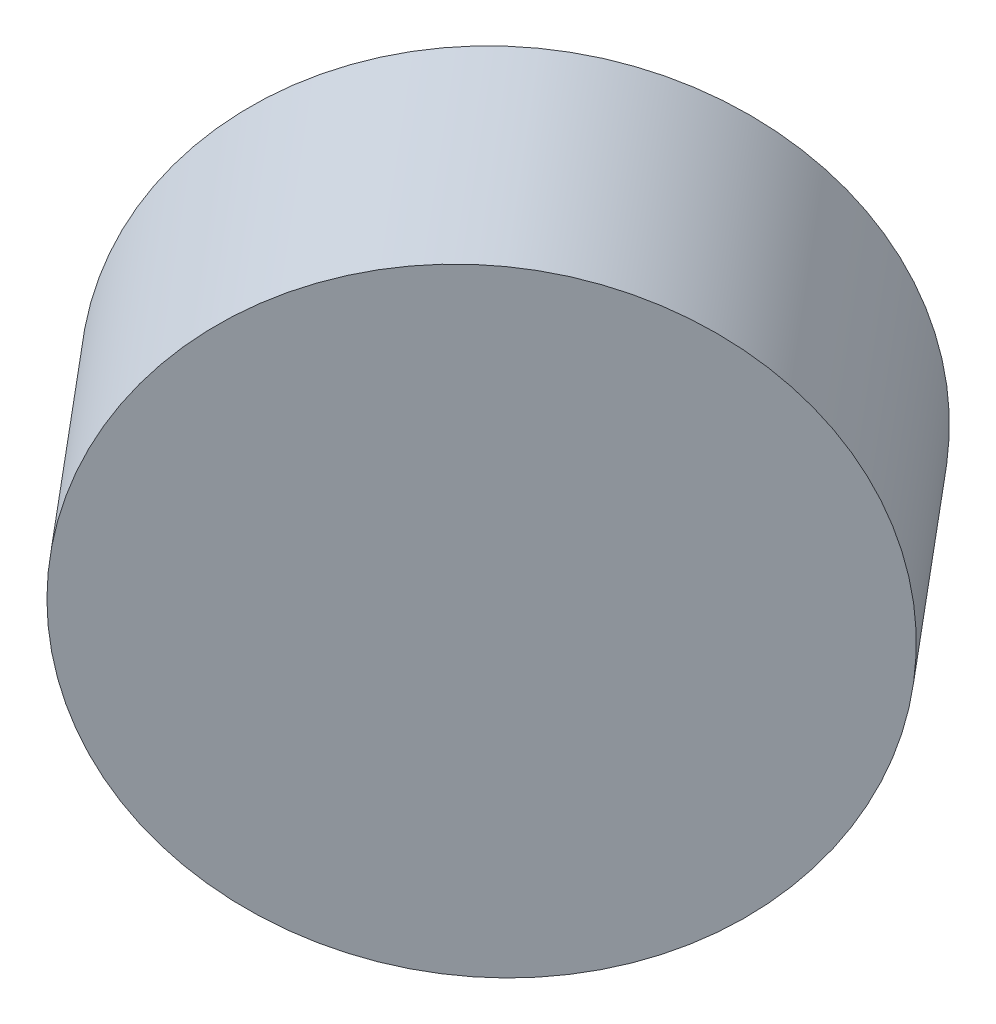
ISO-10303-21;
HEADER;
FILE_DESCRIPTION(('STEP AP214'),'2;1');
FILE_NAME('part.step','',(''),(''),'','','');
FILE_SCHEMA(('AUTOMOTIVE_DESIGN { 1 0 10303 214 1 1 1 1 }'));
ENDSEC;
DATA;
#1=APPLICATION_CONTEXT('core data for automotive mechanical design processes');
#2=APPLICATION_PROTOCOL_DEFINITION('international standard','automotive_design',2000,#1);
#3=PRODUCT_CONTEXT('',#1,'mechanical');
#4=PRODUCT('Part','Part','',(#3));
#5=PRODUCT_RELATED_PRODUCT_CATEGORY('part','',(#4));
#6=PRODUCT_DEFINITION_FORMATION('','',#4);
#7=PRODUCT_DEFINITION_CONTEXT('part definition',#1,'design');
#8=PRODUCT_DEFINITION('design','',#6,#7);
#9=PRODUCT_DEFINITION_SHAPE('','',#8);
#10=(LENGTH_UNIT() NAMED_UNIT(*) SI_UNIT(.MILLI.,.METRE.));
#11=(NAMED_UNIT(*) PLANE_ANGLE_UNIT() SI_UNIT($,.RADIAN.));
#12=(NAMED_UNIT(*) SI_UNIT($,.STERADIAN.) SOLID_ANGLE_UNIT());
#13=UNCERTAINTY_MEASURE_WITH_UNIT(LENGTH_MEASURE(1.E-05),#10,'distance_accuracy_value','');
#14=(GEOMETRIC_REPRESENTATION_CONTEXT(3) GLOBAL_UNCERTAINTY_ASSIGNED_CONTEXT((#13)) GLOBAL_UNIT_ASSIGNED_CONTEXT((#10,
#11,#12)) REPRESENTATION_CONTEXT('',''));
#15=CARTESIAN_POINT('',(0.,0.,0.));
#16=DIRECTION('',(0.,0.,1.));
#17=DIRECTION('',(1.,0.,0.));
#18=AXIS2_PLACEMENT_3D('',#15,#16,#17);
#19=CARTESIAN_POINT('',(-6.738333275244,3.25,-14.25332819631));
#20=DIRECTION('',(0.642787609686505,0.,0.766044443119007));
#21=DIRECTION('',(0.,-1.,0.));
#22=AXIS2_PLACEMENT_3D('',#19,#20,#21);
#23=PLANE('',#22);
#24=CARTESIAN_POINT('',(-6.738333275244,3.25,-14.25332819631));
#25=DIRECTION('',(0.642787609686505,0.,0.766044443119007));
#26=DIRECTION('',(0.766044443119007,0.,-0.642787609686505));
#27=AXIS2_PLACEMENT_3D('',#24,#25,#26);
#28=CIRCLE('',#27,1.15);
#29=CARTESIAN_POINT('',(-7.61928438483007,3.25,-13.5141224451712));
#30=VERTEX_POINT('',#29);
#31=EDGE_CURVE('E42',#30,#30,#28,.T.);
#32=ORIENTED_EDGE('',*,*,#31,.T.);
#33=EDGE_LOOP('',(#32));
#34=FACE_BOUND('',#33,.T.);
#35=ADVANCED_FACE('F17',(#34),#23,.T.);
#36=CARTESIAN_POINT('',(-7.38112088493,3.25,-15.01937263943));
#37=DIRECTION('',(0.642787609686505,0.,0.766044443119007));
#38=DIRECTION('',(0.,-1.,0.));
#39=AXIS2_PLACEMENT_3D('',#36,#37,#38);
#40=PLANE('',#39);
#41=CARTESIAN_POINT('',(-7.38112088493,3.25,-15.01937263943));
#42=DIRECTION('',(-0.642787609686505,0.,-0.766044443119007));
#43=DIRECTION('',(-0.766044443119007,0.,0.642787609686505));
#44=AXIS2_PLACEMENT_3D('',#41,#42,#43);
#45=CIRCLE('',#44,1.15);
#46=CARTESIAN_POINT('',(-8.26207199451686,3.25,-14.2801668882905));
#47=VERTEX_POINT('',#46);
#48=EDGE_CURVE('E11',#47,#47,#45,.T.);
#49=ORIENTED_EDGE('',*,*,#48,.T.);
#50=EDGE_LOOP('',(#49));
#51=FACE_BOUND('',#50,.T.);
#52=ADVANCED_FACE('F65',(#51),#40,.F.);
#53=CARTESIAN_POINT('',(-7.38112088493,3.25,-15.01937263943));
#54=DIRECTION('',(0.642787609686505,0.,0.766044443119007));
#55=DIRECTION('',(0.766044443119007,0.,-0.642787609686505));
#56=AXIS2_PLACEMENT_3D('',#53,#54,#55);
#57=CYLINDRICAL_SURFACE('',#56,1.15);
#58=ORIENTED_EDGE('',*,*,#31,.F.);
#59=DIRECTION('',(-0.642787609686505,0.,-0.766044443119007));
#60=VECTOR('',#59,1.);
#61=CARTESIAN_POINT('',(-8.26207199451686,3.25,-14.2801668882905));
#62=LINE('',#61,#60);
#63=EDGE_CURVE('E20',#30,#47,#62,.T.);
#64=ORIENTED_EDGE('',*,*,#63,.T.);
#65=ORIENTED_EDGE('',*,*,#48,.F.);
#66=ORIENTED_EDGE('',*,*,#63,.F.);
#67=EDGE_LOOP('',(#58,#64,#65,#66));
#68=FACE_BOUND('',#67,.T.);
#69=ADVANCED_FACE('F41',(#68),#57,.T.);
#70=CLOSED_SHELL('',(#35,#52,#69));
#71=MANIFOLD_SOLID_BREP('B1',#70);
#72=ADVANCED_BREP_SHAPE_REPRESENTATION('',(#18,#71),#14);
#73=SHAPE_DEFINITION_REPRESENTATION(#9,#72);
ENDSEC;
END-ISO-10303-21;
